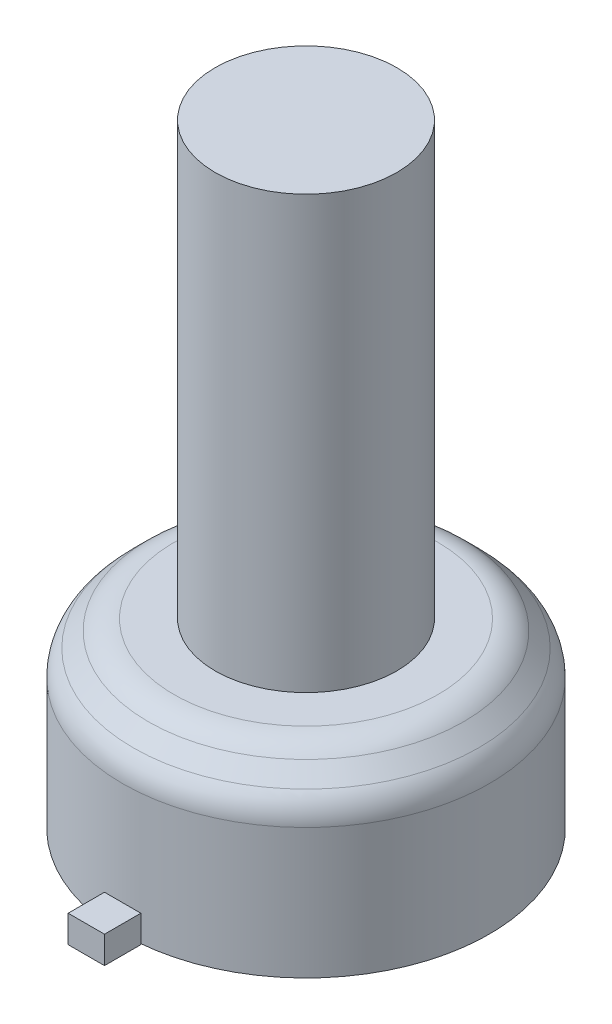
ISO-10303-21;
HEADER;
FILE_DESCRIPTION(('STEP AP214'),'2;1');
FILE_NAME('part.step','',(''),(''),'','','');
FILE_SCHEMA(('AUTOMOTIVE_DESIGN { 1 0 10303 214 1 1 1 1 }'));
ENDSEC;
DATA;
#1=APPLICATION_CONTEXT('core data for automotive mechanical design processes');
#2=APPLICATION_PROTOCOL_DEFINITION('international standard','automotive_design',2000,#1);
#3=PRODUCT_CONTEXT('',#1,'mechanical');
#4=PRODUCT('Part','Part','',(#3));
#5=PRODUCT_RELATED_PRODUCT_CATEGORY('part','',(#4));
#6=PRODUCT_DEFINITION_FORMATION('','',#4);
#7=PRODUCT_DEFINITION_CONTEXT('part definition',#1,'design');
#8=PRODUCT_DEFINITION('design','',#6,#7);
#9=PRODUCT_DEFINITION_SHAPE('','',#8);
#10=(LENGTH_UNIT() NAMED_UNIT(*) SI_UNIT(.MILLI.,.METRE.));
#11=(NAMED_UNIT(*) PLANE_ANGLE_UNIT() SI_UNIT($,.RADIAN.));
#12=(NAMED_UNIT(*) SI_UNIT($,.STERADIAN.) SOLID_ANGLE_UNIT());
#13=UNCERTAINTY_MEASURE_WITH_UNIT(LENGTH_MEASURE(1.E-05),#10,'distance_accuracy_value','');
#14=(GEOMETRIC_REPRESENTATION_CONTEXT(3) GLOBAL_UNCERTAINTY_ASSIGNED_CONTEXT((#13)) GLOBAL_UNIT_ASSIGNED_CONTEXT((#10,
#11,#12)) REPRESENTATION_CONTEXT('',''));
#15=CARTESIAN_POINT('',(0.,0.,0.));
#16=DIRECTION('',(0.,0.,1.));
#17=DIRECTION('',(1.,0.,0.));
#18=AXIS2_PLACEMENT_3D('',#15,#16,#17);
#19=CARTESIAN_POINT('',(1.,-8.5,12.0875754185799));
#20=DIRECTION('',(0.,-1.,0.));
#21=DIRECTION('',(0.,0.,-1.));
#22=AXIS2_PLACEMENT_3D('',#19,#20,#21);
#23=PLANE('',#22);
#24=DIRECTION('',(0.,0.,1.));
#25=VECTOR('',#24,1.);
#26=CARTESIAN_POINT('',(-1.,-8.5,12.0875754185799));
#27=LINE('',#26,#25);
#28=CARTESIAN_POINT('',(-1.,-8.5,10.0875754185799));
#29=VERTEX_POINT('',#28);
#30=CARTESIAN_POINT('',(-1.,-8.5,12.0875754185799));
#31=VERTEX_POINT('',#30);
#32=EDGE_CURVE('E116',#29,#31,#27,.T.);
#33=ORIENTED_EDGE('',*,*,#32,.T.);
#34=DIRECTION('',(-1.,0.,0.));
#35=VECTOR('',#34,1.);
#36=CARTESIAN_POINT('',(1.,-8.5,12.0875754185799));
#37=LINE('',#36,#35);
#38=CARTESIAN_POINT('',(1.,-8.5,12.0875754185799));
#39=VERTEX_POINT('',#38);
#40=EDGE_CURVE('E12',#39,#31,#37,.T.);
#41=ORIENTED_EDGE('',*,*,#40,.F.);
#42=DIRECTION('',(0.,0.,1.));
#43=VECTOR('',#42,1.);
#44=CARTESIAN_POINT('',(1.,-8.5,12.0875754185799));
#45=LINE('',#44,#43);
#46=CARTESIAN_POINT('',(1.,-8.5,10.0875754185799));
#47=VERTEX_POINT('',#46);
#48=EDGE_CURVE('E104',#47,#39,#45,.T.);
#49=ORIENTED_EDGE('',*,*,#48,.F.);
#50=DIRECTION('',(-1.,0.,0.));
#51=VECTOR('',#50,1.);
#52=CARTESIAN_POINT('',(1.,-8.5,10.0875754185799));
#53=LINE('',#52,#51);
#54=EDGE_CURVE('E112',#47,#29,#53,.T.);
#55=ORIENTED_EDGE('',*,*,#54,.T.);
#56=EDGE_LOOP('',(#33,#41,#49,#55));
#57=FACE_BOUND('',#56,.T.);
#58=ADVANCED_FACE('F53',(#57),#23,.F.);
#59=CARTESIAN_POINT('',(1.,-10.,12.0875754185799));
#60=DIRECTION('',(0.,0.,-1.));
#61=DIRECTION('',(-1.,0.,0.));
#62=AXIS2_PLACEMENT_3D('',#59,#60,#61);
#63=PLANE('',#62);
#64=DIRECTION('',(0.,-1.,0.));
#65=VECTOR('',#64,1.);
#66=CARTESIAN_POINT('',(-1.,-10.,12.0875754185799));
#67=LINE('',#66,#65);
#68=CARTESIAN_POINT('',(-1.,-10.,12.0875754185799));
#69=VERTEX_POINT('',#68);
#70=EDGE_CURVE('E108',#31,#69,#67,.T.);
#71=ORIENTED_EDGE('',*,*,#70,.T.);
#72=DIRECTION('',(-1.,0.,0.));
#73=VECTOR('',#72,1.);
#74=CARTESIAN_POINT('',(1.,-10.,12.0875754185799));
#75=LINE('',#74,#73);
#76=CARTESIAN_POINT('',(1.,-10.,12.0875754185799));
#77=VERTEX_POINT('',#76);
#78=EDGE_CURVE('E61',#77,#69,#75,.T.);
#79=ORIENTED_EDGE('',*,*,#78,.F.);
#80=DIRECTION('',(0.,-1.,0.));
#81=VECTOR('',#80,1.);
#82=CARTESIAN_POINT('',(1.,-10.,12.0875754185799));
#83=LINE('',#82,#81);
#84=EDGE_CURVE('E99',#39,#77,#83,.T.);
#85=ORIENTED_EDGE('',*,*,#84,.F.);
#86=ORIENTED_EDGE('',*,*,#40,.T.);
#87=EDGE_LOOP('',(#71,#79,#85,#86));
#88=FACE_BOUND('',#87,.T.);
#89=ADVANCED_FACE('F107',(#88),#63,.F.);
#90=CARTESIAN_POINT('',(1.,-10.,10.0875754185799));
#91=DIRECTION('',(0.,1.,0.));
#92=DIRECTION('',(0.,0.,1.));
#93=AXIS2_PLACEMENT_3D('',#90,#91,#92);
#94=PLANE('',#93);
#95=DIRECTION('',(0.,0.,-1.));
#96=VECTOR('',#95,1.);
#97=CARTESIAN_POINT('',(-1.,-10.,10.0875754185799));
#98=LINE('',#97,#96);
#99=CARTESIAN_POINT('',(-1.,-10.,10.0875754185799));
#100=VERTEX_POINT('',#99);
#101=EDGE_CURVE('E86',#69,#100,#98,.T.);
#102=ORIENTED_EDGE('',*,*,#101,.T.);
#103=DIRECTION('',(-1.,0.,0.));
#104=VECTOR('',#103,1.);
#105=CARTESIAN_POINT('',(1.,-10.,10.0875754185799));
#106=LINE('',#105,#104);
#107=CARTESIAN_POINT('',(1.,-10.,10.0875754185799));
#108=VERTEX_POINT('',#107);
#109=EDGE_CURVE('E109',#108,#100,#106,.T.);
#110=ORIENTED_EDGE('',*,*,#109,.F.);
#111=DIRECTION('',(0.,0.,-1.));
#112=VECTOR('',#111,1.);
#113=CARTESIAN_POINT('',(1.,-10.,10.0875754185799));
#114=LINE('',#113,#112);
#115=EDGE_CURVE('E102',#77,#108,#114,.T.);
#116=ORIENTED_EDGE('',*,*,#115,.F.);
#117=ORIENTED_EDGE('',*,*,#78,.T.);
#118=EDGE_LOOP('',(#102,#110,#116,#117));
#119=FACE_BOUND('',#118,.T.);
#120=ADVANCED_FACE('F110',(#119),#94,.F.);
#121=CARTESIAN_POINT('',(1.,-10.,10.0875754185799));
#122=DIRECTION('',(0.,0.,1.));
#123=DIRECTION('',(1.,0.,0.));
#124=AXIS2_PLACEMENT_3D('',#121,#122,#123);
#125=PLANE('',#124);
#126=DIRECTION('',(0.,1.,0.));
#127=VECTOR('',#126,1.);
#128=CARTESIAN_POINT('',(-1.,-10.,10.0875754185799));
#129=LINE('',#128,#127);
#130=EDGE_CURVE('E92',#100,#29,#129,.T.);
#131=ORIENTED_EDGE('',*,*,#130,.T.);
#132=ORIENTED_EDGE('',*,*,#54,.F.);
#133=DIRECTION('',(0.,1.,0.));
#134=VECTOR('',#133,1.);
#135=CARTESIAN_POINT('',(1.,-10.,10.0875754185799));
#136=LINE('',#135,#134);
#137=EDGE_CURVE('E69',#108,#47,#136,.T.);
#138=ORIENTED_EDGE('',*,*,#137,.F.);
#139=ORIENTED_EDGE('',*,*,#109,.T.);
#140=EDGE_LOOP('',(#131,#132,#138,#139));
#141=FACE_BOUND('',#140,.T.);
#142=ADVANCED_FACE('F123',(#141),#125,.F.);
#143=CARTESIAN_POINT('',(1.,0.,0.));
#144=DIRECTION('',(1.,0.,0.));
#145=DIRECTION('',(0.,0.,-1.));
#146=AXIS2_PLACEMENT_3D('',#143,#144,#145);
#147=PLANE('',#146);
#148=ORIENTED_EDGE('',*,*,#48,.T.);
#149=ORIENTED_EDGE('',*,*,#84,.T.);
#150=ORIENTED_EDGE('',*,*,#115,.T.);
#151=ORIENTED_EDGE('',*,*,#137,.T.);
#152=EDGE_LOOP('',(#148,#149,#150,#151));
#153=FACE_BOUND('',#152,.T.);
#154=ADVANCED_FACE('F100',(#153),#147,.T.);
#155=CARTESIAN_POINT('',(-1.,0.,0.));
#156=DIRECTION('',(1.,0.,0.));
#157=DIRECTION('',(0.,0.,-1.));
#158=AXIS2_PLACEMENT_3D('',#155,#156,#157);
#159=PLANE('',#158);
#160=ORIENTED_EDGE('',*,*,#32,.F.);
#161=ORIENTED_EDGE('',*,*,#130,.F.);
#162=ORIENTED_EDGE('',*,*,#101,.F.);
#163=ORIENTED_EDGE('',*,*,#70,.F.);
#164=EDGE_LOOP('',(#160,#161,#162,#163));
#165=FACE_BOUND('',#164,.T.);
#166=ADVANCED_FACE('F126',(#165),#159,.F.);
#167=CLOSED_SHELL('',(#58,#89,#120,#142,#154,#166));
#168=MANIFOLD_SOLID_BREP('B2',#167);
#169=CARTESIAN_POINT('',(0.,23.75,0.));
#170=DIRECTION('',(0.,-1.,0.));
#171=DIRECTION('',(0.,0.,-1.));
#172=AXIS2_PLACEMENT_3D('',#169,#170,#171);
#173=CYLINDRICAL_SURFACE('',#172,5.);
#174=CARTESIAN_POINT('',(0.,23.75,0.));
#175=DIRECTION('',(0.,1.,0.));
#176=DIRECTION('',(0.,0.,1.));
#177=AXIS2_PLACEMENT_3D('',#174,#175,#176);
#178=CIRCLE('',#177,5.);
#179=CARTESIAN_POINT('',(0.,23.75,5.));
#180=VERTEX_POINT('',#179);
#181=EDGE_CURVE('E213',#180,#180,#178,.T.);
#182=ORIENTED_EDGE('',*,*,#181,.F.);
#183=EDGE_LOOP('',(#182));
#184=FACE_BOUND('',#183,.T.);
#185=CARTESIAN_POINT('',(0.,0.,0.));
#186=DIRECTION('',(0.,1.,0.));
#187=DIRECTION('',(0.,0.,1.));
#188=AXIS2_PLACEMENT_3D('',#185,#186,#187);
#189=CIRCLE('',#188,5.);
#190=CARTESIAN_POINT('',(0.,0.,5.));
#191=VERTEX_POINT('',#190);
#192=EDGE_CURVE('E214',#191,#191,#189,.T.);
#193=ORIENTED_EDGE('',*,*,#192,.T.);
#194=EDGE_LOOP('',(#193));
#195=FACE_BOUND('',#194,.T.);
#196=ADVANCED_FACE('F189',(#184,#195),#173,.T.);
#197=CARTESIAN_POINT('',(0.,23.75,0.));
#198=DIRECTION('',(0.,1.,0.));
#199=DIRECTION('',(0.,0.,1.));
#200=AXIS2_PLACEMENT_3D('',#197,#198,#199);
#201=PLANE('',#200);
#202=ORIENTED_EDGE('',*,*,#181,.T.);
#203=EDGE_LOOP('',(#202));
#204=FACE_BOUND('',#203,.T.);
#205=ADVANCED_FACE('F230',(#204),#201,.T.);
#206=CARTESIAN_POINT('',(0.,-10.,0.));
#207=DIRECTION('',(0.,1.,0.));
#208=DIRECTION('',(0.,0.,1.));
#209=AXIS2_PLACEMENT_3D('',#206,#207,#208);
#210=CYLINDRICAL_SURFACE('',#209,10.0875754185799);
#211=CARTESIAN_POINT('',(0.,-2.82842712474619,0.));
#212=DIRECTION('',(0.,1.,0.));
#213=DIRECTION('',(0.,0.,1.));
#214=AXIS2_PLACEMENT_3D('',#211,#212,#213);
#215=CIRCLE('',#214,10.0875754185799);
#216=CARTESIAN_POINT('',(0.,-2.82842712474619,10.0875754185799));
#217=VERTEX_POINT('',#216);
#218=EDGE_CURVE('E197',#217,#217,#215,.F.);
#219=ORIENTED_EDGE('',*,*,#218,.T.);
#220=EDGE_LOOP('',(#219));
#221=FACE_BOUND('',#220,.T.);
#222=CARTESIAN_POINT('',(0.,-10.,0.));
#223=DIRECTION('',(0.,-1.,0.));
#224=DIRECTION('',(0.,0.,-1.));
#225=AXIS2_PLACEMENT_3D('',#222,#223,#224);
#226=CIRCLE('',#225,10.0875754185799);
#227=CARTESIAN_POINT('',(0.,-10.,-10.0875754185799));
#228=VERTEX_POINT('',#227);
#229=EDGE_CURVE('E218',#228,#228,#226,.T.);
#230=ORIENTED_EDGE('',*,*,#229,.F.);
#231=EDGE_LOOP('',(#230));
#232=FACE_BOUND('',#231,.T.);
#233=ADVANCED_FACE('F228',(#221,#232),#210,.T.);
#234=CARTESIAN_POINT('',(0.,-10.,0.));
#235=DIRECTION('',(0.,-1.,0.));
#236=DIRECTION('',(0.,0.,-1.));
#237=AXIS2_PLACEMENT_3D('',#234,#235,#236);
#238=PLANE('',#237);
#239=ORIENTED_EDGE('',*,*,#229,.T.);
#240=EDGE_LOOP('',(#239));
#241=FACE_BOUND('',#240,.T.);
#242=ADVANCED_FACE('F226',(#241),#238,.T.);
#243=CARTESIAN_POINT('',(0.,0.,0.));
#244=DIRECTION('',(0.,-1.,0.));
#245=DIRECTION('',(0.,0.,-1.));
#246=AXIS2_PLACEMENT_3D('',#243,#244,#245);
#247=PLANE('',#246);
#248=CARTESIAN_POINT('',(0.,0.,0.));
#249=DIRECTION('',(0.,-1.,0.));
#250=DIRECTION('',(0.,0.,-1.));
#251=AXIS2_PLACEMENT_3D('',#248,#249,#250);
#252=CIRCLE('',#251,7.25914829383372);
#253=CARTESIAN_POINT('',(0.,0.,-7.25914829383372));
#254=VERTEX_POINT('',#253);
#255=EDGE_CURVE('E207',#254,#254,#252,.F.);
#256=ORIENTED_EDGE('',*,*,#255,.T.);
#257=EDGE_LOOP('',(#256));
#258=FACE_BOUND('',#257,.T.);
#259=ORIENTED_EDGE('',*,*,#192,.F.);
#260=EDGE_LOOP('',(#259));
#261=FACE_BOUND('',#260,.T.);
#262=ADVANCED_FACE('F236',(#258,#261),#247,.F.);
#263=CARTESIAN_POINT('',(0.,-2.,0.));
#264=DIRECTION('',(0.,-1.,0.));
#265=DIRECTION('',(0.,0.,-1.));
#266=AXIS2_PLACEMENT_3D('',#263,#264,#265);
#267=CONICAL_SURFACE('',#266,10.0875754185799,0.785398163397449);
#268=CARTESIAN_POINT('',(0.,-1.41421356237309,0.));
#269=DIRECTION('',(0.,-1.,0.));
#270=DIRECTION('',(0.,0.,-1.));
#271=AXIS2_PLACEMENT_3D('',#268,#269,#270);
#272=CIRCLE('',#271,9.501788980953);
#273=CARTESIAN_POINT('',(0.,-1.41421356237309,-9.501788980953));
#274=VERTEX_POINT('',#273);
#275=EDGE_CURVE('E52',#274,#274,#272,.F.);
#276=ORIENTED_EDGE('',*,*,#275,.T.);
#277=EDGE_LOOP('',(#276));
#278=FACE_BOUND('',#277,.T.);
#279=CARTESIAN_POINT('',(0.,-0.585786437626903,0.));
#280=DIRECTION('',(0.,-1.,0.));
#281=DIRECTION('',(0.,0.,-1.));
#282=AXIS2_PLACEMENT_3D('',#279,#280,#281);
#283=CIRCLE('',#282,8.67336185620681);
#284=CARTESIAN_POINT('',(0.,-0.585786437626903,-8.67336185620681));
#285=VERTEX_POINT('',#284);
#286=EDGE_CURVE('E202',#285,#285,#283,.T.);
#287=ORIENTED_EDGE('',*,*,#286,.T.);
#288=EDGE_LOOP('',(#287));
#289=FACE_BOUND('',#288,.T.);
#290=ADVANCED_FACE('F250',(#278,#289),#267,.T.);
#291=CARTESIAN_POINT('',(0.,-2.,0.));
#292=DIRECTION('',(0.,-1.,0.));
#293=DIRECTION('',(0.,0.,-1.));
#294=AXIS2_PLACEMENT_3D('',#291,#292,#293);
#295=TOROIDAL_SURFACE('',#294,7.25914829383372,2.);
#296=ORIENTED_EDGE('',*,*,#286,.F.);
#297=EDGE_LOOP('',(#296));
#298=FACE_BOUND('',#297,.T.);
#299=ORIENTED_EDGE('',*,*,#255,.F.);
#300=EDGE_LOOP('',(#299));
#301=FACE_BOUND('',#300,.T.);
#302=ADVANCED_FACE('F254',(#298,#301),#295,.T.);
#303=CARTESIAN_POINT('',(0.,-2.82842712474619,0.));
#304=DIRECTION('',(0.,1.,0.));
#305=DIRECTION('',(0.,0.,1.));
#306=AXIS2_PLACEMENT_3D('',#303,#304,#305);
#307=TOROIDAL_SURFACE('',#306,8.08757541857991,2.);
#308=ORIENTED_EDGE('',*,*,#275,.F.);
#309=EDGE_LOOP('',(#308));
#310=FACE_BOUND('',#309,.T.);
#311=ORIENTED_EDGE('',*,*,#218,.F.);
#312=EDGE_LOOP('',(#311));
#313=FACE_BOUND('',#312,.T.);
#314=ADVANCED_FACE('F191',(#310,#313),#307,.T.);
#315=CLOSED_SHELL('',(#196,#205,#233,#242,#262,#290,#302,#314));
#316=MANIFOLD_SOLID_BREP('B6',#315);
#317=ADVANCED_BREP_SHAPE_REPRESENTATION('',(#18,#168,#316),#14);
#318=SHAPE_DEFINITION_REPRESENTATION(#9,#317);
ENDSEC;
END-ISO-10303-21;
